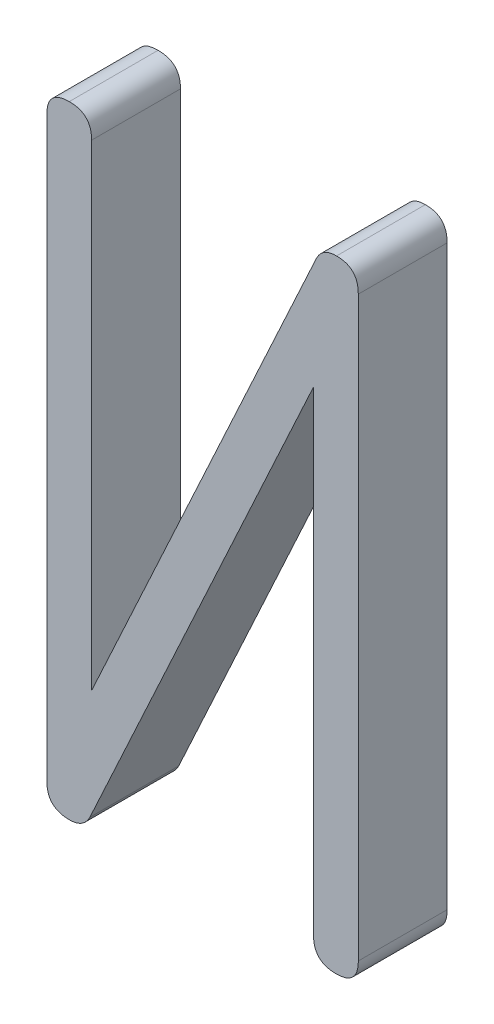
ISO-10303-21;
HEADER;
FILE_DESCRIPTION(('STEP AP214'),'2;1');
FILE_NAME('part.step','',(''),(''),'','','');
FILE_SCHEMA(('AUTOMOTIVE_DESIGN { 1 0 10303 214 1 1 1 1 }'));
ENDSEC;
DATA;
#1=APPLICATION_CONTEXT('core data for automotive mechanical design processes');
#2=APPLICATION_PROTOCOL_DEFINITION('international standard','automotive_design',2000,#1);
#3=PRODUCT_CONTEXT('',#1,'mechanical');
#4=PRODUCT('Part','Part','',(#3));
#5=PRODUCT_RELATED_PRODUCT_CATEGORY('part','',(#4));
#6=PRODUCT_DEFINITION_FORMATION('','',#4);
#7=PRODUCT_DEFINITION_CONTEXT('part definition',#1,'design');
#8=PRODUCT_DEFINITION('design','',#6,#7);
#9=PRODUCT_DEFINITION_SHAPE('','',#8);
#10=(LENGTH_UNIT() NAMED_UNIT(*) SI_UNIT(.MILLI.,.METRE.));
#11=(NAMED_UNIT(*) PLANE_ANGLE_UNIT() SI_UNIT($,.RADIAN.));
#12=(NAMED_UNIT(*) SI_UNIT($,.STERADIAN.) SOLID_ANGLE_UNIT());
#13=UNCERTAINTY_MEASURE_WITH_UNIT(LENGTH_MEASURE(1.E-05),#10,'distance_accuracy_value','');
#14=(GEOMETRIC_REPRESENTATION_CONTEXT(3) GLOBAL_UNCERTAINTY_ASSIGNED_CONTEXT((#13)) GLOBAL_UNIT_ASSIGNED_CONTEXT((#10,
#11,#12)) REPRESENTATION_CONTEXT('',''));
#15=CARTESIAN_POINT('',(0.,0.,0.));
#16=DIRECTION('',(0.,0.,1.));
#17=DIRECTION('',(1.,0.,0.));
#18=AXIS2_PLACEMENT_3D('',#15,#16,#17);
#19=CARTESIAN_POINT('',(0.,0.,0.));
#20=DIRECTION('',(0.,0.,1.));
#21=DIRECTION('',(1.,0.,0.));
#22=AXIS2_PLACEMENT_3D('',#19,#20,#21);
#23=PLANE('',#22);
#24=CARTESIAN_POINT('',(20.7466183712734,-8.0244422451301,0.));
#25=CARTESIAN_POINT('',(20.7466102572844,-8.0224022168674,0.));
#26=CARTESIAN_POINT('',(20.7464899556735,-8.0203311767163,0.));
#27=CARTESIAN_POINT('',(20.7458654797782,-8.01620848382131,0.));
#28=CARTESIAN_POINT('',(20.7453532801265,-8.01415815634594,0.));
#29=CARTESIAN_POINT('',(20.7437666144459,-8.01024004258373,0.));
#30=CARTESIAN_POINT('',(20.7426879186743,-8.00837375668214,0.));
#31=CARTESIAN_POINT('',(20.7399187444826,-8.00514520536651,0.));
#32=CARTESIAN_POINT('',(20.7382260110757,-8.00378483565948,0.));
#33=CARTESIAN_POINT('',(20.7341003144471,-8.00144486847008,0.));
#34=CARTESIAN_POINT('',(20.7315865738601,-8.00062280385289,0.));
#35=CARTESIAN_POINT('',(20.7264882862824,-7.99963800979068,0.));
#36=CARTESIAN_POINT('',(20.7239073046317,-7.99945861672726,0.));
#37=CARTESIAN_POINT('',(20.7214183712734,-7.9994522451301,0.));
#38=B_SPLINE_CURVE_WITH_KNOTS('',3,(#24,#25,#26,#27,#28,#29,#30,#31,#32,#33,#34,#35,#36,#37),
.UNSPECIFIED.,.F.,.F.,(4,2,2,2,2,2,4),(0.,0.00616648259272341,0.0124627395857316,
0.0188066903326218,0.0251741784016711,0.032993449546906,0.0406084478282406),.UNSPECIFIED.);
#39=CARTESIAN_POINT('',(20.7466183712734,-8.0244422451301,0.));
#40=VERTEX_POINT('',#39);
#41=CARTESIAN_POINT('',(20.7214183712734,-7.9994522451301,0.));
#42=VERTEX_POINT('',#41);
#43=EDGE_CURVE('E277',#40,#42,#38,.T.);
#44=ORIENTED_EDGE('',*,*,#43,.T.);
#45=CARTESIAN_POINT('',(20.7214183712734,-7.9994522451301,0.));
#46=CARTESIAN_POINT('',(20.7193258804503,-7.99946114416743,0.));
#47=CARTESIAN_POINT('',(20.7171995489885,-7.99958423738709,0.));
#48=CARTESIAN_POINT('',(20.7129661144323,-8.00022884092584,0.));
#49=CARTESIAN_POINT('',(20.7108604557814,-8.00075902989129,0.));
#50=CARTESIAN_POINT('',(20.7068942566944,-8.00238768718714,0.));
#51=CARTESIAN_POINT('',(20.7050300452579,-8.00347595807679,0.));
#52=CARTESIAN_POINT('',(20.7018087720133,-8.00626346451553,0.));
#53=CARTESIAN_POINT('',(20.7004536706445,-8.00796501335827,0.));
#54=CARTESIAN_POINT('',(20.6981370975254,-8.01209916286323,0.));
#55=CARTESIAN_POINT('',(20.6973302383169,-8.01461018671716,0.));
#56=CARTESIAN_POINT('',(20.6963933741925,-8.01960027878006,0.));
#57=CARTESIAN_POINT('',(20.6962235257344,-8.02207119264994,0.));
#58=CARTESIAN_POINT('',(20.6962183712734,-8.0244597451301,0.));
#59=B_SPLINE_CURVE_WITH_KNOTS('',3,(#45,#46,#47,#48,#49,#50,#51,#52,#53,#54,#55,#56,#57,#58),
.UNSPECIFIED.,.F.,.F.,(4,2,2,2,2,2,4),(0.,0.00632865589769019,0.0127961082036628,
0.0191493863521885,0.0255268843609806,0.0333230170829363,0.0406225102328515),.UNSPECIFIED.);
#60=CARTESIAN_POINT('',(20.6962183712734,-8.0244597451301,0.));
#61=VERTEX_POINT('',#60);
#62=EDGE_CURVE('E133',#42,#61,#59,.T.);
#63=ORIENTED_EDGE('',*,*,#62,.T.);
#64=DIRECTION('',(0.,1.,0.));
#65=VECTOR('',#64,1.);
#66=CARTESIAN_POINT('',(20.6962183712734,-8.0244597451301,0.));
#67=LINE('',#66,#65);
#68=CARTESIAN_POINT('',(20.6962183712734,-8.6744447451301,0.));
#69=VERTEX_POINT('',#68);
#70=EDGE_CURVE('E128',#69,#61,#67,.T.);
#71=ORIENTED_EDGE('',*,*,#70,.F.);
#72=CARTESIAN_POINT('',(20.6962183712734,-8.6744447451301,0.));
#73=CARTESIAN_POINT('',(20.696226064701,-8.67646376012185,0.));
#74=CARTESIAN_POINT('',(20.6963452924619,-8.67851226686788,0.));
#75=CARTESIAN_POINT('',(20.6969608199596,-8.68258971619137,0.));
#76=CARTESIAN_POINT('',(20.6974647985037,-8.68461739711406,0.));
#77=CARTESIAN_POINT('',(20.6990345909797,-8.68852825234281,0.));
#78=CARTESIAN_POINT('',(20.7001136011195,-8.69040678944372,0.));
#79=CARTESIAN_POINT('',(20.7028874814319,-8.69365883987099,0.));
#80=CARTESIAN_POINT('',(20.704584580252,-8.69503048898576,0.));
#81=CARTESIAN_POINT('',(20.7087294685676,-8.6973993073391,0.));
#82=CARTESIAN_POINT('',(20.7112600836127,-8.69823604689115,0.));
#83=CARTESIAN_POINT('',(20.7164598664999,-8.69925830676223,0.));
#84=CARTESIAN_POINT('',(20.7191287897237,-8.6994449395105,0.));
#85=CARTESIAN_POINT('',(20.7216983712734,-8.6994522451301,0.));
#86=B_SPLINE_CURVE_WITH_KNOTS('',3,(#72,#73,#74,#75,#76,#77,#78,#79,#80,#81,#82,#83,#84,#85),
.UNSPECIFIED.,.F.,.F.,(4,2,2,2,2,2,4),(0.,0.00610084746813675,0.0123267448899595,
0.0187020922226004,0.0251006585430096,0.0329819365329433,0.0408497218438376),.UNSPECIFIED.);
#87=CARTESIAN_POINT('',(20.7216983712734,-8.6994522451301,0.));
#88=VERTEX_POINT('',#87);
#89=EDGE_CURVE('E24',#69,#88,#86,.T.);
#90=ORIENTED_EDGE('',*,*,#89,.T.);
#91=CARTESIAN_POINT('',(20.7216983712734,-8.6994522451301,0.));
#92=CARTESIAN_POINT('',(20.7232219755692,-8.6994513520954,0.));
#93=CARTESIAN_POINT('',(20.7247521076158,-8.69935329854479,0.));
#94=CARTESIAN_POINT('',(20.7277842724719,-8.6989126409191,0.));
#95=CARTESIAN_POINT('',(20.7292860911639,-8.69856862351141,0.));
#96=CARTESIAN_POINT('',(20.7331285415499,-8.69727186573174,0.));
#97=CARTESIAN_POINT('',(20.735395376619,-8.6960711628565,0.));
#98=CARTESIAN_POINT('',(20.7393687785571,-8.69298109341724,0.));
#99=CARTESIAN_POINT('',(20.7410760977958,-8.69109265891103,0.));
#100=CARTESIAN_POINT('',(20.7433039406839,-8.68786734688451,0.));
#101=CARTESIAN_POINT('',(20.7440151491407,-8.68665675346357,0.));
#102=CARTESIAN_POINT('',(20.7446408712734,-8.6854172451301,0.));
#103=B_SPLINE_CURVE_WITH_KNOTS('',3,(#91,#92,#93,#94,#95,#96,#97,#98,#99,#100,#101,#102),
.UNSPECIFIED.,.F.,.F.,(4,2,2,2,2,4),(0.,0.00457654629606413,0.0091796034341876,
0.016709354278033,0.0242289380696418,0.0284172090697284),.UNSPECIFIED.);
#104=CARTESIAN_POINT('',(20.7446408712734,-8.6854172451301,0.));
#105=VERTEX_POINT('',#104);
#106=EDGE_CURVE('E166',#88,#105,#103,.T.);
#107=ORIENTED_EDGE('',*,*,#106,.T.);
#108=DIRECTION('',(0.419141323860063,0.907921004621456,0.));
#109=VECTOR('',#108,1.);
#110=CARTESIAN_POINT('',(20.7446408712734,-8.6854172451301,0.));
#111=LINE('',#110,#109);
#112=CARTESIAN_POINT('',(20.9963783712734,-8.1401172451301,0.));
#113=VERTEX_POINT('',#112);
#114=EDGE_CURVE('E164',#113,#105,#111,.F.);
#115=ORIENTED_EDGE('',*,*,#114,.F.);
#116=DIRECTION('',(0.,1.,0.));
#117=VECTOR('',#116,1.);
#118=CARTESIAN_POINT('',(20.9963783712734,-8.1401172451301,0.));
#119=LINE('',#118,#117);
#120=CARTESIAN_POINT('',(20.9963783712734,-8.6745497451301,0.));
#121=VERTEX_POINT('',#120);
#122=EDGE_CURVE('E157',#121,#113,#119,.T.);
#123=ORIENTED_EDGE('',*,*,#122,.F.);
#124=CARTESIAN_POINT('',(20.9963783712734,-8.6745497451301,0.));
#125=CARTESIAN_POINT('',(20.9963863102294,-8.67657504084812,0.));
#126=CARTESIAN_POINT('',(20.9965058012154,-8.67863071081031,0.));
#127=CARTESIAN_POINT('',(20.9971249104316,-8.68272267256517,0.));
#128=CARTESIAN_POINT('',(20.9976324051327,-8.68475766590274,0.));
#129=CARTESIAN_POINT('',(20.9992074142738,-8.68865871083131,0.));
#130=CARTESIAN_POINT('',(21.0002821944123,-8.69052219333784,0.));
#131=CARTESIAN_POINT('',(21.0030426414955,-8.69374667785672,0.));
#132=CARTESIAN_POINT('',(21.0047305463443,-8.69510580174161,0.));
#133=CARTESIAN_POINT('',(21.008847342783,-8.6974467914926,0.));
#134=CARTESIAN_POINT('',(21.0113573967953,-8.69827074146409,0.));
#135=CARTESIAN_POINT('',(21.0164707752572,-8.69926442949644,0.));
#136=CARTESIAN_POINT('',(21.0190716321299,-8.6994455927525,0.));
#137=CARTESIAN_POINT('',(21.0215783712734,-8.6994522451301,0.));
#138=B_SPLINE_CURVE_WITH_KNOTS('',3,(#124,#125,#126,#127,#128,#129,#130,#131,#132,#133,#134,
#135,#136,#137),.UNSPECIFIED.,.F.,.F.,(4,2,2,2,2,2,4),(0.,0.00612121982034276,
0.0123701121634095,0.0187010539466967,0.025055339748897,0.0328663454030807,0.0405377990669631),.UNSPECIFIED.);
#139=CARTESIAN_POINT('',(21.0215783712734,-8.6994522451301,0.));
#140=VERTEX_POINT('',#139);
#141=EDGE_CURVE('E247',#121,#140,#138,.T.);
#142=ORIENTED_EDGE('',*,*,#141,.T.);
#143=CARTESIAN_POINT('',(21.0215783712734,-8.6994522451301,0.));
#144=CARTESIAN_POINT('',(21.0236708620965,-8.69944334609277,0.));
#145=CARTESIAN_POINT('',(21.0257971935583,-8.69932025287311,0.));
#146=CARTESIAN_POINT('',(21.0300306281145,-8.69867564933436,0.));
#147=CARTESIAN_POINT('',(21.0321362867654,-8.69814546036891,0.));
#148=CARTESIAN_POINT('',(21.0361024858524,-8.69651680307306,0.));
#149=CARTESIAN_POINT('',(21.0379666972889,-8.69542853218342,0.));
#150=CARTESIAN_POINT('',(21.0411879705335,-8.69264102574468,0.));
#151=CARTESIAN_POINT('',(21.0425430719023,-8.69093947690193,0.));
#152=CARTESIAN_POINT('',(21.0448596450214,-8.68680532739697,0.));
#153=CARTESIAN_POINT('',(21.0456665042299,-8.68429430354305,0.));
#154=CARTESIAN_POINT('',(21.0466033683543,-8.67930421148014,0.));
#155=CARTESIAN_POINT('',(21.0467732168124,-8.67683329761025,0.));
#156=CARTESIAN_POINT('',(21.0467783712734,-8.6744447451301,0.));
#157=B_SPLINE_CURVE_WITH_KNOTS('',3,(#143,#144,#145,#146,#147,#148,#149,#150,#151,#152,#153,
#154,#155,#156),.UNSPECIFIED.,.F.,.F.,(4,2,2,2,2,2,4),(0.,0.00632865589769019,0.012796108203659,
0.0191493863521859,0.025526884360978,0.033323017082933,0.0406225102328523),.UNSPECIFIED.);
#158=CARTESIAN_POINT('',(21.0467783712734,-8.6744447451301,0.));
#159=VERTEX_POINT('',#158);
#160=EDGE_CURVE('E156',#140,#159,#157,.T.);
#161=ORIENTED_EDGE('',*,*,#160,.T.);
#162=DIRECTION('',(0.,1.,0.));
#163=VECTOR('',#162,1.);
#164=CARTESIAN_POINT('',(21.0467783712734,-8.6744447451301,0.));
#165=LINE('',#164,#163);
#166=CARTESIAN_POINT('',(21.0467783712734,-8.0244597451301,0.));
#167=VERTEX_POINT('',#166);
#168=EDGE_CURVE('E153',#167,#159,#165,.F.);
#169=ORIENTED_EDGE('',*,*,#168,.F.);
#170=CARTESIAN_POINT('',(21.0467783712734,-8.0244597451301,0.));
#171=CARTESIAN_POINT('',(21.0467689229469,-8.02235495500093,0.));
#172=CARTESIAN_POINT('',(21.0466453834,-8.02021439398975,0.));
#173=CARTESIAN_POINT('',(21.0459936918086,-8.01595203311235,0.));
#174=CARTESIAN_POINT('',(21.0454564285428,-8.0138317592805,0.));
#175=CARTESIAN_POINT('',(21.0438169260454,-8.00988421542062,0.));
#176=CARTESIAN_POINT('',(21.0427367121097,-8.00804892101653,0.));
#177=CARTESIAN_POINT('',(21.0399749418669,-8.00488065730504,0.));
#178=CARTESIAN_POINT('',(21.0382910624326,-8.00354967003311,0.));
#179=CARTESIAN_POINT('',(21.0342099428444,-8.00128547708292,0.));
#180=CARTESIAN_POINT('',(21.0317372188408,-8.00050243144118,0.));
#181=CARTESIAN_POINT('',(21.0269036256392,-7.99961633301527,0.));
#182=CARTESIAN_POINT('',(21.0245539499753,-7.99945649357537,0.));
#183=CARTESIAN_POINT('',(21.0222783712734,-7.9994522451301,0.));
#184=B_SPLINE_CURVE_WITH_KNOTS('',3,(#170,#171,#172,#173,#174,#175,#176,#177,#178,#179,#180,
#181,#182,#183),.UNSPECIFIED.,.F.,.F.,(4,2,2,2,2,2,4),(0.,0.00636892627281275,
0.0128822703642211,0.0191504691565467,0.025443053899129,0.0331086429415663,0.0400567392329565),.UNSPECIFIED.);
#185=CARTESIAN_POINT('',(21.0222783712734,-7.9994522451301,0.));
#186=VERTEX_POINT('',#185);
#187=EDGE_CURVE('E287',#167,#186,#184,.T.);
#188=ORIENTED_EDGE('',*,*,#187,.T.);
#189=CARTESIAN_POINT('',(21.0222783712734,-7.9994522451301,0.));
#190=CARTESIAN_POINT('',(21.0205032694577,-7.99945216753152,0.));
#191=CARTESIAN_POINT('',(21.0187119262132,-7.99957910187316,0.));
#192=CARTESIAN_POINT('',(21.015176727991,-8.00016689665609,0.));
#193=CARTESIAN_POINT('',(21.0134332255542,-8.0006297711154,0.));
#194=CARTESIAN_POINT('',(21.0095248461474,-8.00220148362672,0.));
#195=CARTESIAN_POINT('',(21.0074207429011,-8.00347750836067,0.));
#196=CARTESIAN_POINT('',(21.0037878716913,-8.00665798465891,0.));
#197=CARTESIAN_POINT('',(21.0022582162943,-8.00856145829669,0.));
#198=CARTESIAN_POINT('',(21.0003502474809,-8.0116941885832,0.));
#199=CARTESIAN_POINT('',(20.9997719207015,-8.01280778985586,0.));
#200=CARTESIAN_POINT('',(20.9992658712734,-8.0139422451301,0.));
#201=B_SPLINE_CURVE_WITH_KNOTS('',3,(#189,#190,#191,#192,#193,#194,#195,#196,#197,#198,#199,
#200),.UNSPECIFIED.,.F.,.F.,(4,2,2,2,2,4),(0.,0.00534523337421063,0.0107227798608192,
0.0179461004926656,0.0251582158480714,0.0289040222259598),.UNSPECIFIED.);
#202=CARTESIAN_POINT('',(20.9992658712734,-8.0139422451301,0.));
#203=VERTEX_POINT('',#202);
#204=EDGE_CURVE('E150',#186,#203,#201,.T.);
#205=ORIENTED_EDGE('',*,*,#204,.T.);
#206=DIRECTION('',(-0.419358406260656,-0.907820757142357,0.));
#207=VECTOR('',#206,1.);
#208=CARTESIAN_POINT('',(20.9992658712734,-8.0139422451301,0.));
#209=LINE('',#208,#207);
#210=CARTESIAN_POINT('',(20.7466183712734,-8.5608697451301,0.));
#211=VERTEX_POINT('',#210);
#212=EDGE_CURVE('E148',#211,#203,#209,.F.);
#213=ORIENTED_EDGE('',*,*,#212,.F.);
#214=DIRECTION('',(0.,1.,0.));
#215=VECTOR('',#214,1.);
#216=CARTESIAN_POINT('',(20.7466183712734,-8.5608697451301,0.));
#217=LINE('',#216,#215);
#218=EDGE_CURVE('E141',#40,#211,#217,.F.);
#219=ORIENTED_EDGE('',*,*,#218,.F.);
#220=EDGE_LOOP('',(#44,#63,#71,#90,#107,#115,#123,#142,#161,#169,#188,#205,#213,#219));
#221=FACE_BOUND('',#220,.T.);
#222=ADVANCED_FACE('F17',(#221),#23,.T.);
#223=CARTESIAN_POINT('',(20.6962183712734,-8.6744447451301,-0.1));
#224=CARTESIAN_POINT('',(20.6962183712734,-8.6994522451301,-0.1));
#225=CARTESIAN_POINT('',(20.7216983712734,-8.6994522451301,-0.1));
#226=CARTESIAN_POINT('',(20.6962183712734,-8.6744447451301,0.));
#227=CARTESIAN_POINT('',(20.6962183712734,-8.6994522451301,0.));
#228=CARTESIAN_POINT('',(20.7216983712734,-8.6994522451301,0.));
#229=B_SPLINE_SURFACE_WITH_KNOTS('',1,2,((#223,#224,#225),(#226,#227,#228)),.UNSPECIFIED.,.F.,
.F.,.F.,(2,2),(3,3),(0.,1.),(0.,1.),.UNSPECIFIED.);
#230=DIRECTION('',(0.,0.,1.));
#231=VECTOR('',#230,1.);
#232=CARTESIAN_POINT('',(20.6962183712734,-8.6744447451301,-0.1));
#233=LINE('',#232,#231);
#234=CARTESIAN_POINT('',(20.6962183712734,-8.6744447451301,-0.1));
#235=VERTEX_POINT('',#234);
#236=EDGE_CURVE('E121',#235,#69,#233,.T.);
#237=CARTESIAN_POINT('',(20.6962183712734,-8.6744447451301,-0.1));
#238=CARTESIAN_POINT('',(20.696226064701,-8.67646376012185,-0.1));
#239=CARTESIAN_POINT('',(20.6963452924619,-8.67851226686788,-0.1));
#240=CARTESIAN_POINT('',(20.6969608199596,-8.68258971619137,-0.1));
#241=CARTESIAN_POINT('',(20.6974647985037,-8.68461739711406,-0.1));
#242=CARTESIAN_POINT('',(20.6990345909797,-8.68852825234281,-0.1));
#243=CARTESIAN_POINT('',(20.7001136011195,-8.69040678944372,-0.1));
#244=CARTESIAN_POINT('',(20.7028874814319,-8.69365883987099,-0.1));
#245=CARTESIAN_POINT('',(20.704584580252,-8.69503048898576,-0.1));
#246=CARTESIAN_POINT('',(20.7087294685676,-8.6973993073391,-0.1));
#247=CARTESIAN_POINT('',(20.7112600836127,-8.69823604689115,-0.1));
#248=CARTESIAN_POINT('',(20.7164598664999,-8.69925830676223,-0.1));
#249=CARTESIAN_POINT('',(20.7191287897237,-8.6994449395105,-0.1));
#250=CARTESIAN_POINT('',(20.7216983712734,-8.6994522451301,-0.1));
#251=B_SPLINE_CURVE_WITH_KNOTS('',3,(#237,#238,#239,#240,#241,#242,#243,#244,#245,#246,#247,
#248,#249,#250),.UNSPECIFIED.,.F.,.F.,(4,2,2,2,2,2,4),(0.,0.00610084746813675,
0.0123267448899595,0.0187020922226004,0.0251006585430096,0.0329819365329433,0.0408497218438376),.UNSPECIFIED.);
#252=CARTESIAN_POINT('',(20.7216983712734,-8.6994522451301,-0.1));
#253=VERTEX_POINT('',#252);
#254=EDGE_CURVE('E130',#235,#253,#251,.T.);
#255=DIRECTION('',(0.,0.,1.));
#256=VECTOR('',#255,1.);
#257=CARTESIAN_POINT('',(20.7216983712734,-8.6994522451301,-0.05));
#258=LINE('',#257,#256);
#259=EDGE_CURVE('E122',#253,#88,#258,.T.);
#260=ORIENTED_EDGE('',*,*,#236,.F.);
#261=ORIENTED_EDGE('',*,*,#254,.T.);
#262=ORIENTED_EDGE('',*,*,#259,.T.);
#263=ORIENTED_EDGE('',*,*,#89,.F.);
#264=EDGE_LOOP('',(#260,#261,#262,#263));
#265=FACE_BOUND('',#264,.T.);
#266=ADVANCED_FACE('F119',(#265),#229,.F.);
#267=CARTESIAN_POINT('',(20.7216983712734,-8.6994522451301,-0.1));
#268=CARTESIAN_POINT('',(20.7375008712734,-8.6994522451301,-0.1));
#269=CARTESIAN_POINT('',(20.7446408712734,-8.6854172451301,-0.1));
#270=CARTESIAN_POINT('',(20.7216983712734,-8.6994522451301,0.));
#271=CARTESIAN_POINT('',(20.7375008712734,-8.6994522451301,0.));
#272=CARTESIAN_POINT('',(20.7446408712734,-8.6854172451301,0.));
#273=B_SPLINE_SURFACE_WITH_KNOTS('',1,2,((#267,#268,#269),(#270,#271,#272)),.UNSPECIFIED.,.F.,
.F.,.F.,(2,2),(3,3),(0.,1.),(0.,1.),.UNSPECIFIED.);
#274=CARTESIAN_POINT('',(20.7216983712734,-8.6994522451301,-0.1));
#275=CARTESIAN_POINT('',(20.7232219755692,-8.6994513520954,-0.1));
#276=CARTESIAN_POINT('',(20.7247521076158,-8.69935329854479,-0.1));
#277=CARTESIAN_POINT('',(20.7277842724719,-8.6989126409191,-0.1));
#278=CARTESIAN_POINT('',(20.7292860911639,-8.69856862351141,-0.1));
#279=CARTESIAN_POINT('',(20.7331285415499,-8.69727186573174,-0.1));
#280=CARTESIAN_POINT('',(20.735395376619,-8.6960711628565,-0.1));
#281=CARTESIAN_POINT('',(20.7393687785571,-8.69298109341724,-0.1));
#282=CARTESIAN_POINT('',(20.7410760977958,-8.69109265891103,-0.1));
#283=CARTESIAN_POINT('',(20.7433039406839,-8.68786734688451,-0.1));
#284=CARTESIAN_POINT('',(20.7440151491407,-8.68665675346357,-0.1));
#285=CARTESIAN_POINT('',(20.7446408712734,-8.6854172451301,-0.1));
#286=B_SPLINE_CURVE_WITH_KNOTS('',3,(#274,#275,#276,#277,#278,#279,#280,#281,#282,#283,#284,
#285),.UNSPECIFIED.,.F.,.F.,(4,2,2,2,2,4),(0.,0.00457654629606413,0.0091796034341876,
0.016709354278033,0.0242289380696418,0.0284172090697284),.UNSPECIFIED.);
#287=CARTESIAN_POINT('',(20.7446408712734,-8.6854172451301,-0.1));
#288=VERTEX_POINT('',#287);
#289=EDGE_CURVE('E189',#253,#288,#286,.T.);
#290=DIRECTION('',(0.,0.,1.));
#291=VECTOR('',#290,1.);
#292=CARTESIAN_POINT('',(20.7446408712734,-8.6854172451301,-0.1));
#293=LINE('',#292,#291);
#294=EDGE_CURVE('E161',#105,#288,#293,.F.);
#295=ORIENTED_EDGE('',*,*,#259,.F.);
#296=ORIENTED_EDGE('',*,*,#289,.T.);
#297=ORIENTED_EDGE('',*,*,#294,.F.);
#298=ORIENTED_EDGE('',*,*,#106,.F.);
#299=EDGE_LOOP('',(#295,#296,#297,#298));
#300=FACE_BOUND('',#299,.T.);
#301=ADVANCED_FACE('F233',(#300),#273,.F.);
#302=CARTESIAN_POINT('',(20.7446408712734,-8.6854172451301,-0.1));
#303=DIRECTION('',(0.907921004621456,-0.419141323860063,0.));
#304=DIRECTION('',(0.419141323860063,0.907921004621456,0.));
#305=AXIS2_PLACEMENT_3D('',#302,#303,#304);
#306=PLANE('',#305);
#307=DIRECTION('',(0.419141323860068,0.907921004621453,0.));
#308=VECTOR('',#307,1.);
#309=CARTESIAN_POINT('',(20.7446408712734,-8.6854172451301,-0.1));
#310=LINE('',#309,#308);
#311=CARTESIAN_POINT('',(20.9963783712734,-8.1401172451301,-0.1));
#312=VERTEX_POINT('',#311);
#313=EDGE_CURVE('E368',#288,#312,#310,.T.);
#314=ORIENTED_EDGE('',*,*,#313,.T.);
#315=DIRECTION('',(0.,0.,1.));
#316=VECTOR('',#315,1.);
#317=CARTESIAN_POINT('',(20.9963783712734,-8.1401172451301,-0.1));
#318=LINE('',#317,#316);
#319=EDGE_CURVE('E160',#113,#312,#318,.F.);
#320=ORIENTED_EDGE('',*,*,#319,.F.);
#321=ORIENTED_EDGE('',*,*,#114,.T.);
#322=ORIENTED_EDGE('',*,*,#294,.T.);
#323=EDGE_LOOP('',(#314,#320,#321,#322));
#324=FACE_BOUND('',#323,.T.);
#325=ADVANCED_FACE('F264',(#324),#306,.T.);
#326=CARTESIAN_POINT('',(20.9963783712734,-8.1401172451301,-0.1));
#327=DIRECTION('',(-1.,0.,0.));
#328=DIRECTION('',(0.,0.,1.));
#329=AXIS2_PLACEMENT_3D('',#326,#327,#328);
#330=PLANE('',#329);
#331=DIRECTION('',(0.,1.,0.));
#332=VECTOR('',#331,1.);
#333=CARTESIAN_POINT('',(20.9963783712734,0.,-0.1));
#334=LINE('',#333,#332);
#335=CARTESIAN_POINT('',(20.9963783712734,-8.6745497451301,-0.1));
#336=VERTEX_POINT('',#335);
#337=EDGE_CURVE('E224',#312,#336,#334,.F.);
#338=ORIENTED_EDGE('',*,*,#337,.T.);
#339=DIRECTION('',(0.,0.,1.));
#340=VECTOR('',#339,1.);
#341=CARTESIAN_POINT('',(20.9963783712734,-8.6745497451301,-0.05));
#342=LINE('',#341,#340);
#343=EDGE_CURVE('E253',#336,#121,#342,.T.);
#344=ORIENTED_EDGE('',*,*,#343,.T.);
#345=ORIENTED_EDGE('',*,*,#122,.T.);
#346=ORIENTED_EDGE('',*,*,#319,.T.);
#347=EDGE_LOOP('',(#338,#344,#345,#346));
#348=FACE_BOUND('',#347,.T.);
#349=ADVANCED_FACE('F231',(#348),#330,.T.);
#350=CARTESIAN_POINT('',(20.9963783712734,-8.6745497451301,-0.1));
#351=CARTESIAN_POINT('',(20.9963783712734,-8.6994522451301,-0.1));
#352=CARTESIAN_POINT('',(21.0215783712734,-8.6994522451301,-0.1));
#353=CARTESIAN_POINT('',(20.9963783712734,-8.6745497451301,0.));
#354=CARTESIAN_POINT('',(20.9963783712734,-8.6994522451301,0.));
#355=CARTESIAN_POINT('',(21.0215783712734,-8.6994522451301,0.));
#356=B_SPLINE_SURFACE_WITH_KNOTS('',1,2,((#350,#351,#352),(#353,#354,#355)),.UNSPECIFIED.,.F.,
.F.,.F.,(2,2),(3,3),(0.,1.),(0.,1.),.UNSPECIFIED.);
#357=CARTESIAN_POINT('',(20.9963783712734,-8.6745497451301,-0.1));
#358=CARTESIAN_POINT('',(20.9963863102294,-8.67657504084813,-0.1));
#359=CARTESIAN_POINT('',(20.9965058012154,-8.67863071081031,-0.1));
#360=CARTESIAN_POINT('',(20.9971249104316,-8.68272267256517,-0.1));
#361=CARTESIAN_POINT('',(20.9976324051327,-8.68475766590274,-0.1));
#362=CARTESIAN_POINT('',(20.9992074142738,-8.68865871083131,-0.1));
#363=CARTESIAN_POINT('',(21.0002821944123,-8.69052219333784,-0.1));
#364=CARTESIAN_POINT('',(21.0030426414955,-8.69374667785672,-0.1));
#365=CARTESIAN_POINT('',(21.0047305463443,-8.69510580174161,-0.1));
#366=CARTESIAN_POINT('',(21.008847342783,-8.6974467914926,-0.1));
#367=CARTESIAN_POINT('',(21.0113573967953,-8.69827074146409,-0.1));
#368=CARTESIAN_POINT('',(21.0164707752572,-8.69926442949644,-0.1));
#369=CARTESIAN_POINT('',(21.0190716321299,-8.6994455927525,-0.1));
#370=CARTESIAN_POINT('',(21.0215783712734,-8.6994522451301,-0.1));
#371=B_SPLINE_CURVE_WITH_KNOTS('',3,(#357,#358,#359,#360,#361,#362,#363,#364,#365,#366,#367,
#368,#369,#370),.UNSPECIFIED.,.F.,.F.,(4,2,2,2,2,2,4),(0.,0.00612121982034424,
0.0123701121634102,0.0187010539466974,0.0250553397488977,0.0328663454030814,0.0405377990669638),.UNSPECIFIED.);
#372=CARTESIAN_POINT('',(21.0215783712734,-8.6994522451301,-0.1));
#373=VERTEX_POINT('',#372);
#374=EDGE_CURVE('E218',#336,#373,#371,.T.);
#375=DIRECTION('',(0.,0.,1.));
#376=VECTOR('',#375,1.);
#377=CARTESIAN_POINT('',(21.0215783712734,-8.6994522451301,-0.05));
#378=LINE('',#377,#376);
#379=EDGE_CURVE('E252',#373,#140,#378,.T.);
#380=ORIENTED_EDGE('',*,*,#343,.F.);
#381=ORIENTED_EDGE('',*,*,#374,.T.);
#382=ORIENTED_EDGE('',*,*,#379,.T.);
#383=ORIENTED_EDGE('',*,*,#141,.F.);
#384=EDGE_LOOP('',(#380,#381,#382,#383));
#385=FACE_BOUND('',#384,.T.);
#386=ADVANCED_FACE('F225',(#385),#356,.F.);
#387=CARTESIAN_POINT('',(21.0215783712734,-8.6994522451301,-0.1));
#388=CARTESIAN_POINT('',(21.0467783712734,-8.6994522451301,-0.1));
#389=CARTESIAN_POINT('',(21.0467783712734,-8.6744447451301,-0.1));
#390=CARTESIAN_POINT('',(21.0215783712734,-8.6994522451301,0.));
#391=CARTESIAN_POINT('',(21.0467783712734,-8.6994522451301,0.));
#392=CARTESIAN_POINT('',(21.0467783712734,-8.6744447451301,0.));
#393=B_SPLINE_SURFACE_WITH_KNOTS('',1,2,((#387,#388,#389),(#390,#391,#392)),.UNSPECIFIED.,.F.,
.F.,.F.,(2,2),(3,3),(0.,1.),(0.,1.),.UNSPECIFIED.);
#394=CARTESIAN_POINT('',(21.0215783712734,-8.6994522451301,-0.1));
#395=CARTESIAN_POINT('',(21.0236708620965,-8.69944334609277,-0.1));
#396=CARTESIAN_POINT('',(21.0257971935583,-8.69932025287311,-0.1));
#397=CARTESIAN_POINT('',(21.0300306281145,-8.69867564933436,-0.1));
#398=CARTESIAN_POINT('',(21.0321362867654,-8.69814546036891,-0.1));
#399=CARTESIAN_POINT('',(21.0361024858524,-8.69651680307306,-0.1));
#400=CARTESIAN_POINT('',(21.0379666972889,-8.69542853218342,-0.1));
#401=CARTESIAN_POINT('',(21.0411879705335,-8.69264102574468,-0.1));
#402=CARTESIAN_POINT('',(21.0425430719023,-8.69093947690193,-0.1));
#403=CARTESIAN_POINT('',(21.0448596450214,-8.68680532739697,-0.1));
#404=CARTESIAN_POINT('',(21.0456665042299,-8.68429430354305,-0.1));
#405=CARTESIAN_POINT('',(21.0466033683543,-8.67930421148014,-0.1));
#406=CARTESIAN_POINT('',(21.0467732168124,-8.67683329761025,-0.1));
#407=CARTESIAN_POINT('',(21.0467783712734,-8.6744447451301,-0.1));
#408=B_SPLINE_CURVE_WITH_KNOTS('',3,(#394,#395,#396,#397,#398,#399,#400,#401,#402,#403,#404,
#405,#406,#407),.UNSPECIFIED.,.F.,.F.,(4,2,2,2,2,2,4),(0.,0.00632865589769019,0.012796108203659,
0.0191493863521859,0.025526884360978,0.033323017082933,0.0406225102328523),.UNSPECIFIED.);
#409=CARTESIAN_POINT('',(21.0467783712734,-8.6744447451301,-0.1));
#410=VERTEX_POINT('',#409);
#411=EDGE_CURVE('E213',#373,#410,#408,.T.);
#412=DIRECTION('',(0.,0.,-1.));
#413=VECTOR('',#412,1.);
#414=CARTESIAN_POINT('',(21.0467783712734,-8.6744447451301,-0.1));
#415=LINE('',#414,#413);
#416=EDGE_CURVE('E155',#159,#410,#415,.T.);
#417=ORIENTED_EDGE('',*,*,#379,.F.);
#418=ORIENTED_EDGE('',*,*,#411,.T.);
#419=ORIENTED_EDGE('',*,*,#416,.F.);
#420=ORIENTED_EDGE('',*,*,#160,.F.);
#421=EDGE_LOOP('',(#417,#418,#419,#420));
#422=FACE_BOUND('',#421,.T.);
#423=ADVANCED_FACE('F230',(#422),#393,.F.);
#424=CARTESIAN_POINT('',(21.0467783712734,-8.6744447451301,-0.1));
#425=DIRECTION('',(1.,0.,0.));
#426=DIRECTION('',(0.,0.,-1.));
#427=AXIS2_PLACEMENT_3D('',#424,#425,#426);
#428=PLANE('',#427);
#429=DIRECTION('',(0.,1.,0.));
#430=VECTOR('',#429,1.);
#431=CARTESIAN_POINT('',(21.0467783712734,0.,-0.1));
#432=LINE('',#431,#430);
#433=CARTESIAN_POINT('',(21.0467783712734,-8.0244597451301,-0.1));
#434=VERTEX_POINT('',#433);
#435=EDGE_CURVE('E363',#410,#434,#432,.T.);
#436=ORIENTED_EDGE('',*,*,#435,.T.);
#437=DIRECTION('',(0.,0.,1.));
#438=VECTOR('',#437,1.);
#439=CARTESIAN_POINT('',(21.0467783712734,-8.0244597451301,-0.05));
#440=LINE('',#439,#438);
#441=EDGE_CURVE('E293',#434,#167,#440,.T.);
#442=ORIENTED_EDGE('',*,*,#441,.T.);
#443=ORIENTED_EDGE('',*,*,#168,.T.);
#444=ORIENTED_EDGE('',*,*,#416,.T.);
#445=EDGE_LOOP('',(#436,#442,#443,#444));
#446=FACE_BOUND('',#445,.T.);
#447=ADVANCED_FACE('F300',(#446),#428,.T.);
#448=CARTESIAN_POINT('',(21.0467783712734,-8.0244597451301,-0.1));
#449=CARTESIAN_POINT('',(21.0467783712734,-7.9994522451301,-0.1));
#450=CARTESIAN_POINT('',(21.0222783712734,-7.9994522451301,-0.1));
#451=CARTESIAN_POINT('',(21.0467783712734,-8.0244597451301,0.));
#452=CARTESIAN_POINT('',(21.0467783712734,-7.9994522451301,0.));
#453=CARTESIAN_POINT('',(21.0222783712734,-7.9994522451301,0.));
#454=B_SPLINE_SURFACE_WITH_KNOTS('',1,2,((#448,#449,#450),(#451,#452,#453)),.UNSPECIFIED.,.F.,
.F.,.F.,(2,2),(3,3),(0.,1.),(0.,1.),.UNSPECIFIED.);
#455=CARTESIAN_POINT('',(21.0467783712734,-8.0244597451301,-0.1));
#456=CARTESIAN_POINT('',(21.0467689229469,-8.02235495500093,-0.1));
#457=CARTESIAN_POINT('',(21.0466453834,-8.02021439398975,-0.1));
#458=CARTESIAN_POINT('',(21.0459936918086,-8.01595203311235,-0.1));
#459=CARTESIAN_POINT('',(21.0454564285428,-8.0138317592805,-0.1));
#460=CARTESIAN_POINT('',(21.0438169260454,-8.00988421542062,-0.1));
#461=CARTESIAN_POINT('',(21.0427367121097,-8.00804892101653,-0.1));
#462=CARTESIAN_POINT('',(21.0399749418669,-8.00488065730504,-0.1));
#463=CARTESIAN_POINT('',(21.0382910624326,-8.00354967003311,-0.1));
#464=CARTESIAN_POINT('',(21.0342099428444,-8.00128547708292,-0.1));
#465=CARTESIAN_POINT('',(21.0317372188408,-8.00050243144118,-0.1));
#466=CARTESIAN_POINT('',(21.0269036256392,-7.99961633301527,-0.1));
#467=CARTESIAN_POINT('',(21.0245539499753,-7.99945649357537,-0.1));
#468=CARTESIAN_POINT('',(21.0222783712734,-7.9994522451301,-0.1));
#469=B_SPLINE_CURVE_WITH_KNOTS('',3,(#455,#456,#457,#458,#459,#460,#461,#462,#463,#464,#465,
#466,#467,#468),.UNSPECIFIED.,.F.,.F.,(4,2,2,2,2,2,4),(0.,0.00636892627281275,
0.0128822703642211,0.0191504691565467,0.025443053899129,0.0331086429415663,0.0400567392329565),.UNSPECIFIED.);
#470=CARTESIAN_POINT('',(21.0222783712734,-7.9994522451301,-0.1));
#471=VERTEX_POINT('',#470);
#472=EDGE_CURVE('E207',#434,#471,#469,.T.);
#473=DIRECTION('',(0.,0.,1.));
#474=VECTOR('',#473,1.);
#475=CARTESIAN_POINT('',(21.0222783712734,-7.9994522451301,-0.05));
#476=LINE('',#475,#474);
#477=EDGE_CURVE('E292',#471,#186,#476,.T.);
#478=ORIENTED_EDGE('',*,*,#441,.F.);
#479=ORIENTED_EDGE('',*,*,#472,.T.);
#480=ORIENTED_EDGE('',*,*,#477,.T.);
#481=ORIENTED_EDGE('',*,*,#187,.F.);
#482=EDGE_LOOP('',(#478,#479,#480,#481));
#483=FACE_BOUND('',#482,.T.);
#484=ADVANCED_FACE('F294',(#483),#454,.F.);
#485=CARTESIAN_POINT('',(21.0222783712734,-7.9994522451301,-0.1));
#486=CARTESIAN_POINT('',(21.0057758712734,-7.9994522451301,-0.1));
#487=CARTESIAN_POINT('',(20.9992658712734,-8.0139422451301,-0.1));
#488=CARTESIAN_POINT('',(21.0222783712734,-7.9994522451301,0.));
#489=CARTESIAN_POINT('',(21.0057758712734,-7.9994522451301,0.));
#490=CARTESIAN_POINT('',(20.9992658712734,-8.0139422451301,0.));
#491=B_SPLINE_SURFACE_WITH_KNOTS('',1,2,((#485,#486,#487),(#488,#489,#490)),.UNSPECIFIED.,.F.,
.F.,.F.,(2,2),(3,3),(0.,1.),(0.,1.),.UNSPECIFIED.);
#492=CARTESIAN_POINT('',(21.0222783712734,-7.9994522451301,-0.1));
#493=CARTESIAN_POINT('',(21.0205032694577,-7.99945216753152,-0.1));
#494=CARTESIAN_POINT('',(21.0187119262132,-7.99957910187316,-0.1));
#495=CARTESIAN_POINT('',(21.015176727991,-8.00016689665609,-0.1));
#496=CARTESIAN_POINT('',(21.0134332255542,-8.0006297711154,-0.1));
#497=CARTESIAN_POINT('',(21.0095248461474,-8.00220148362672,-0.1));
#498=CARTESIAN_POINT('',(21.0074207429011,-8.00347750836067,-0.1));
#499=CARTESIAN_POINT('',(21.0037878716913,-8.00665798465891,-0.1));
#500=CARTESIAN_POINT('',(21.0022582162943,-8.00856145829669,-0.1));
#501=CARTESIAN_POINT('',(21.0003502474809,-8.0116941885832,-0.1));
#502=CARTESIAN_POINT('',(20.9997719207015,-8.01280778985586,-0.1));
#503=CARTESIAN_POINT('',(20.9992658712734,-8.0139422451301,-0.1));
#504=B_SPLINE_CURVE_WITH_KNOTS('',3,(#492,#493,#494,#495,#496,#497,#498,#499,#500,#501,#502,
#503),.UNSPECIFIED.,.F.,.F.,(4,2,2,2,2,4),(0.,0.00534523337421063,0.0107227798608192,
0.0179461004926656,0.0251582158480714,0.0289040222259598),.UNSPECIFIED.);
#505=CARTESIAN_POINT('',(20.9992658712734,-8.0139422451301,-0.1));
#506=VERTEX_POINT('',#505);
#507=EDGE_CURVE('E200',#471,#506,#504,.T.);
#508=DIRECTION('',(0.,0.,1.));
#509=VECTOR('',#508,1.);
#510=CARTESIAN_POINT('',(20.9992658712734,-8.0139422451301,-0.1));
#511=LINE('',#510,#509);
#512=EDGE_CURVE('E145',#203,#506,#511,.F.);
#513=ORIENTED_EDGE('',*,*,#477,.F.);
#514=ORIENTED_EDGE('',*,*,#507,.T.);
#515=ORIENTED_EDGE('',*,*,#512,.F.);
#516=ORIENTED_EDGE('',*,*,#204,.F.);
#517=EDGE_LOOP('',(#513,#514,#515,#516));
#518=FACE_BOUND('',#517,.T.);
#519=ADVANCED_FACE('F299',(#518),#491,.F.);
#520=CARTESIAN_POINT('',(20.9992658712734,-8.0139422451301,-0.1));
#521=DIRECTION('',(-0.907820757142357,0.419358406260656,0.));
#522=DIRECTION('',(-0.419358406260656,-0.907820757142357,0.));
#523=AXIS2_PLACEMENT_3D('',#520,#521,#522);
#524=PLANE('',#523);
#525=DIRECTION('',(-0.419358406260656,-0.907820757142357,0.));
#526=VECTOR('',#525,1.);
#527=CARTESIAN_POINT('',(20.9992658712734,-8.0139422451301,-0.1));
#528=LINE('',#527,#526);
#529=CARTESIAN_POINT('',(20.7466183712734,-8.5608697451301,-0.1));
#530=VERTEX_POINT('',#529);
#531=EDGE_CURVE('E355',#506,#530,#528,.T.);
#532=ORIENTED_EDGE('',*,*,#531,.T.);
#533=DIRECTION('',(0.,0.,-1.));
#534=VECTOR('',#533,1.);
#535=CARTESIAN_POINT('',(20.7466183712734,-8.5608697451301,-0.1));
#536=LINE('',#535,#534);
#537=EDGE_CURVE('E144',#211,#530,#536,.T.);
#538=ORIENTED_EDGE('',*,*,#537,.F.);
#539=ORIENTED_EDGE('',*,*,#212,.T.);
#540=ORIENTED_EDGE('',*,*,#512,.T.);
#541=EDGE_LOOP('',(#532,#538,#539,#540));
#542=FACE_BOUND('',#541,.T.);
#543=ADVANCED_FACE('F312',(#542),#524,.T.);
#544=CARTESIAN_POINT('',(20.7466183712734,-8.5608697451301,-0.1));
#545=DIRECTION('',(1.,0.,0.));
#546=DIRECTION('',(0.,0.,-1.));
#547=AXIS2_PLACEMENT_3D('',#544,#545,#546);
#548=PLANE('',#547);
#549=DIRECTION('',(0.,1.,0.));
#550=VECTOR('',#549,1.);
#551=CARTESIAN_POINT('',(20.7466183712734,0.,-0.1));
#552=LINE('',#551,#550);
#553=CARTESIAN_POINT('',(20.7466183712734,-8.0244422451301,-0.1));
#554=VERTEX_POINT('',#553);
#555=EDGE_CURVE('E351',#530,#554,#552,.T.);
#556=ORIENTED_EDGE('',*,*,#555,.T.);
#557=DIRECTION('',(0.,0.,1.));
#558=VECTOR('',#557,1.);
#559=CARTESIAN_POINT('',(20.7466183712734,-8.0244422451301,-0.05));
#560=LINE('',#559,#558);
#561=EDGE_CURVE('E343',#554,#40,#560,.T.);
#562=ORIENTED_EDGE('',*,*,#561,.T.);
#563=ORIENTED_EDGE('',*,*,#218,.T.);
#564=ORIENTED_EDGE('',*,*,#537,.T.);
#565=EDGE_LOOP('',(#556,#562,#563,#564));
#566=FACE_BOUND('',#565,.T.);
#567=ADVANCED_FACE('F325',(#566),#548,.T.);
#568=CARTESIAN_POINT('',(20.7466183712734,-8.0244422451301,-0.1));
#569=CARTESIAN_POINT('',(20.7466183712734,-7.9994522451301,-0.1));
#570=CARTESIAN_POINT('',(20.7214183712734,-7.9994522451301,-0.1));
#571=CARTESIAN_POINT('',(20.7466183712734,-8.0244422451301,0.));
#572=CARTESIAN_POINT('',(20.7466183712734,-7.9994522451301,0.));
#573=CARTESIAN_POINT('',(20.7214183712734,-7.9994522451301,0.));
#574=B_SPLINE_SURFACE_WITH_KNOTS('',1,2,((#568,#569,#570),(#571,#572,#573)),.UNSPECIFIED.,.F.,
.F.,.F.,(2,2),(3,3),(0.,1.),(0.,1.),.UNSPECIFIED.);
#575=CARTESIAN_POINT('',(20.7466183712734,-8.0244422451301,-0.1));
#576=CARTESIAN_POINT('',(20.7466102572844,-8.0224022168674,-0.1));
#577=CARTESIAN_POINT('',(20.7464899556735,-8.0203311767163,-0.1));
#578=CARTESIAN_POINT('',(20.7458654797782,-8.01620848382131,-0.1));
#579=CARTESIAN_POINT('',(20.7453532801265,-8.01415815634594,-0.1));
#580=CARTESIAN_POINT('',(20.7437666144459,-8.01024004258373,-0.1));
#581=CARTESIAN_POINT('',(20.7426879186743,-8.00837375668214,-0.1));
#582=CARTESIAN_POINT('',(20.7399187444826,-8.00514520536651,-0.1));
#583=CARTESIAN_POINT('',(20.7382260110757,-8.00378483565948,-0.1));
#584=CARTESIAN_POINT('',(20.7341003144471,-8.00144486847008,-0.1));
#585=CARTESIAN_POINT('',(20.7315865738601,-8.00062280385289,-0.1));
#586=CARTESIAN_POINT('',(20.7264882862824,-7.99963800979068,-0.1));
#587=CARTESIAN_POINT('',(20.7239073046317,-7.99945861672726,-0.1));
#588=CARTESIAN_POINT('',(20.7214183712734,-7.9994522451301,-0.1));
#589=B_SPLINE_CURVE_WITH_KNOTS('',3,(#575,#576,#577,#578,#579,#580,#581,#582,#583,#584,#585,
#586,#587,#588),.UNSPECIFIED.,.F.,.F.,(4,2,2,2,2,2,4),(0.,0.00616648259272341,
0.0124627395857316,0.0188066903326218,0.0251741784016711,0.032993449546906,0.0406084478282406),.UNSPECIFIED.);
#590=CARTESIAN_POINT('',(20.7214183712734,-7.9994522451301,-0.1));
#591=VERTEX_POINT('',#590);
#592=EDGE_CURVE('E175',#554,#591,#589,.T.);
#593=DIRECTION('',(0.,0.,1.));
#594=VECTOR('',#593,1.);
#595=CARTESIAN_POINT('',(20.7214183712734,-7.9994522451301,-0.05));
#596=LINE('',#595,#594);
#597=EDGE_CURVE('E136',#591,#42,#596,.T.);
#598=ORIENTED_EDGE('',*,*,#561,.F.);
#599=ORIENTED_EDGE('',*,*,#592,.T.);
#600=ORIENTED_EDGE('',*,*,#597,.T.);
#601=ORIENTED_EDGE('',*,*,#43,.F.);
#602=EDGE_LOOP('',(#598,#599,#600,#601));
#603=FACE_BOUND('',#602,.T.);
#604=ADVANCED_FACE('F314',(#603),#574,.F.);
#605=CARTESIAN_POINT('',(20.7214183712734,-7.9994522451301,-0.1));
#606=CARTESIAN_POINT('',(20.6962183712734,-7.9994522451301,-0.1));
#607=CARTESIAN_POINT('',(20.6962183712734,-8.0244597451301,-0.1));
#608=CARTESIAN_POINT('',(20.7214183712734,-7.9994522451301,0.));
#609=CARTESIAN_POINT('',(20.6962183712734,-7.9994522451301,0.));
#610=CARTESIAN_POINT('',(20.6962183712734,-8.0244597451301,0.));
#611=B_SPLINE_SURFACE_WITH_KNOTS('',1,2,((#605,#606,#607),(#608,#609,#610)),.UNSPECIFIED.,.F.,
.F.,.F.,(2,2),(3,3),(0.,1.),(0.,1.),.UNSPECIFIED.);
#612=CARTESIAN_POINT('',(20.7214183712734,-7.9994522451301,-0.1));
#613=CARTESIAN_POINT('',(20.7193258804503,-7.99946114416743,-0.1));
#614=CARTESIAN_POINT('',(20.7171995489885,-7.99958423738709,-0.1));
#615=CARTESIAN_POINT('',(20.7129661144323,-8.00022884092584,-0.1));
#616=CARTESIAN_POINT('',(20.7108604557814,-8.00075902989129,-0.1));
#617=CARTESIAN_POINT('',(20.7068942566944,-8.00238768718714,-0.1));
#618=CARTESIAN_POINT('',(20.7050300452579,-8.00347595807679,-0.1));
#619=CARTESIAN_POINT('',(20.7018087720133,-8.00626346451553,-0.1));
#620=CARTESIAN_POINT('',(20.7004536706445,-8.00796501335827,-0.1));
#621=CARTESIAN_POINT('',(20.6981370975254,-8.01209916286323,-0.1));
#622=CARTESIAN_POINT('',(20.6973302383169,-8.01461018671716,-0.1));
#623=CARTESIAN_POINT('',(20.6963933741925,-8.01960027878006,-0.1));
#624=CARTESIAN_POINT('',(20.6962235257344,-8.02207119264994,-0.1));
#625=CARTESIAN_POINT('',(20.6962183712734,-8.0244597451301,-0.1));
#626=B_SPLINE_CURVE_WITH_KNOTS('',3,(#612,#613,#614,#615,#616,#617,#618,#619,#620,#621,#622,
#623,#624,#625),.UNSPECIFIED.,.F.,.F.,(4,2,2,2,2,2,4),(0.,0.00632865589769019,
0.0127961082036628,0.0191493863521885,0.0255268843609806,0.0333230170829363,0.0406225102328515),.UNSPECIFIED.);
#627=CARTESIAN_POINT('',(20.6962183712734,-8.0244597451301,-0.1));
#628=VERTEX_POINT('',#627);
#629=EDGE_CURVE('E35',#591,#628,#626,.T.);
#630=DIRECTION('',(0.,0.,1.));
#631=VECTOR('',#630,1.);
#632=CARTESIAN_POINT('',(20.6962183712734,-8.0244597451301,-0.1));
#633=LINE('',#632,#631);
#634=EDGE_CURVE('E43',#61,#628,#633,.F.);
#635=ORIENTED_EDGE('',*,*,#597,.F.);
#636=ORIENTED_EDGE('',*,*,#629,.T.);
#637=ORIENTED_EDGE('',*,*,#634,.F.);
#638=ORIENTED_EDGE('',*,*,#62,.F.);
#639=EDGE_LOOP('',(#635,#636,#637,#638));
#640=FACE_BOUND('',#639,.T.);
#641=ADVANCED_FACE('F19',(#640),#611,.F.);
#642=CARTESIAN_POINT('',(20.6962183712734,-8.0244597451301,-0.1));
#643=DIRECTION('',(-1.,0.,0.));
#644=DIRECTION('',(0.,0.,1.));
#645=AXIS2_PLACEMENT_3D('',#642,#643,#644);
#646=PLANE('',#645);
#647=DIRECTION('',(0.,1.,0.));
#648=VECTOR('',#647,1.);
#649=CARTESIAN_POINT('',(20.6962183712734,0.,-0.1));
#650=LINE('',#649,#648);
#651=EDGE_CURVE('E11',#628,#235,#650,.F.);
#652=ORIENTED_EDGE('',*,*,#651,.T.);
#653=ORIENTED_EDGE('',*,*,#236,.T.);
#654=ORIENTED_EDGE('',*,*,#70,.T.);
#655=ORIENTED_EDGE('',*,*,#634,.T.);
#656=EDGE_LOOP('',(#652,#653,#654,#655));
#657=FACE_BOUND('',#656,.T.);
#658=ADVANCED_FACE('F127',(#657),#646,.T.);
#659=CARTESIAN_POINT('',(0.,0.,-0.1));
#660=DIRECTION('',(0.,0.,1.));
#661=DIRECTION('',(1.,0.,0.));
#662=AXIS2_PLACEMENT_3D('',#659,#660,#661);
#663=PLANE('',#662);
#664=ORIENTED_EDGE('',*,*,#629,.F.);
#665=ORIENTED_EDGE('',*,*,#592,.F.);
#666=ORIENTED_EDGE('',*,*,#555,.F.);
#667=ORIENTED_EDGE('',*,*,#531,.F.);
#668=ORIENTED_EDGE('',*,*,#507,.F.);
#669=ORIENTED_EDGE('',*,*,#472,.F.);
#670=ORIENTED_EDGE('',*,*,#435,.F.);
#671=ORIENTED_EDGE('',*,*,#411,.F.);
#672=ORIENTED_EDGE('',*,*,#374,.F.);
#673=ORIENTED_EDGE('',*,*,#337,.F.);
#674=ORIENTED_EDGE('',*,*,#313,.F.);
#675=ORIENTED_EDGE('',*,*,#289,.F.);
#676=ORIENTED_EDGE('',*,*,#254,.F.);
#677=ORIENTED_EDGE('',*,*,#651,.F.);
#678=EDGE_LOOP('',(#664,#665,#666,#667,#668,#669,#670,#671,#672,#673,#674,#675,#676,#677));
#679=FACE_BOUND('',#678,.T.);
#680=ADVANCED_FACE('F180',(#679),#663,.F.);
#681=CLOSED_SHELL('',(#222,#266,#301,#325,#349,#386,#423,#447,#484,#519,#543,#567,#604,#641,
#658,#680));
#682=MANIFOLD_SOLID_BREP('B1',#681);
#683=ADVANCED_BREP_SHAPE_REPRESENTATION('',(#18,#682),#14);
#684=SHAPE_DEFINITION_REPRESENTATION(#9,#683);
ENDSEC;
END-ISO-10303-21;
